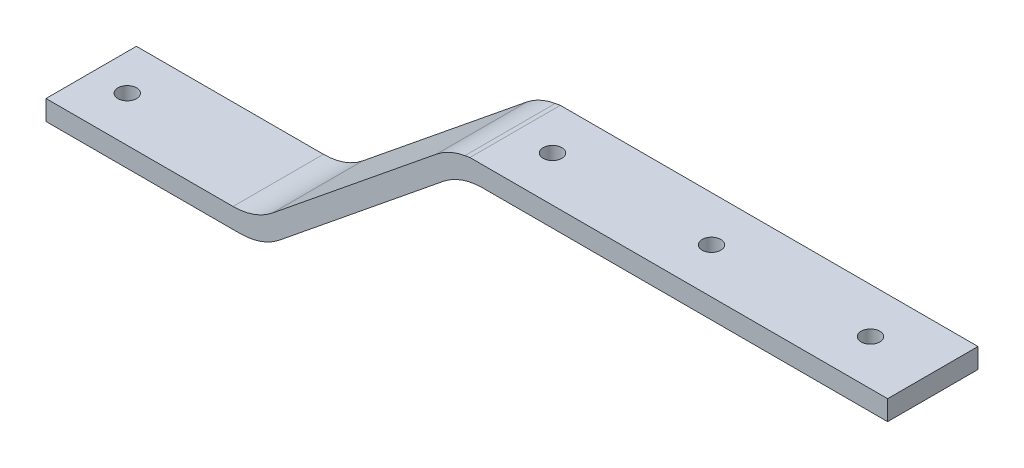
ISO-10303-21;
HEADER;
FILE_DESCRIPTION(('STEP AP214'),'2;1');
FILE_NAME('part.step','',(''),(''),'','','');
FILE_SCHEMA(('AUTOMOTIVE_DESIGN { 1 0 10303 214 1 1 1 1 }'));
ENDSEC;
DATA;
#1=APPLICATION_CONTEXT('core data for automotive mechanical design processes');
#2=APPLICATION_PROTOCOL_DEFINITION('international standard','automotive_design',2000,#1);
#3=PRODUCT_CONTEXT('',#1,'mechanical');
#4=PRODUCT('Part','Part','',(#3));
#5=PRODUCT_RELATED_PRODUCT_CATEGORY('part','',(#4));
#6=PRODUCT_DEFINITION_FORMATION('','',#4);
#7=PRODUCT_DEFINITION_CONTEXT('part definition',#1,'design');
#8=PRODUCT_DEFINITION('design','',#6,#7);
#9=PRODUCT_DEFINITION_SHAPE('','',#8);
#10=(LENGTH_UNIT() NAMED_UNIT(*) SI_UNIT(.MILLI.,.METRE.));
#11=(NAMED_UNIT(*) PLANE_ANGLE_UNIT() SI_UNIT($,.RADIAN.));
#12=(NAMED_UNIT(*) SI_UNIT($,.STERADIAN.) SOLID_ANGLE_UNIT());
#13=UNCERTAINTY_MEASURE_WITH_UNIT(LENGTH_MEASURE(1.E-05),#10,'distance_accuracy_value','');
#14=(GEOMETRIC_REPRESENTATION_CONTEXT(3) GLOBAL_UNCERTAINTY_ASSIGNED_CONTEXT((#13)) GLOBAL_UNIT_ASSIGNED_CONTEXT((#10,
#11,#12)) REPRESENTATION_CONTEXT('',''));
#15=CARTESIAN_POINT('',(0.,0.,0.));
#16=DIRECTION('',(0.,0.,1.));
#17=DIRECTION('',(1.,0.,0.));
#18=AXIS2_PLACEMENT_3D('',#15,#16,#17);
#19=CARTESIAN_POINT('',(-0.807686987093969,41.218627607551,14.5));
#20=DIRECTION('',(0.172838159716736,-0.984950237598698,0.));
#21=DIRECTION('',(0.984950237598698,0.172838159716736,0.));
#22=AXIS2_PLACEMENT_3D('',#19,#20,#21);
#23=PLANE('',#22);
#24=DIRECTION('',(-0.984950237598698,-0.172838159716736,0.));
#25=VECTOR('',#24,1.);
#26=CARTESIAN_POINT('',(-0.807686987093969,41.218627607551,0.));
#27=LINE('',#26,#25);
#28=CARTESIAN_POINT('',(0.,41.3603597754795,0.));
#29=VERTEX_POINT('',#28);
#30=CARTESIAN_POINT('',(-0.807686987093971,41.218627607551,0.));
#31=VERTEX_POINT('',#30);
#32=EDGE_CURVE('E165',#29,#31,#27,.T.);
#33=ORIENTED_EDGE('',*,*,#32,.T.);
#34=DIRECTION('',(0.,0.,-1.));
#35=VECTOR('',#34,1.);
#36=CARTESIAN_POINT('',(-0.807686987093971,41.218627607551,14.5));
#37=LINE('',#36,#35);
#38=CARTESIAN_POINT('',(-0.807686987093971,41.218627607551,14.5));
#39=VERTEX_POINT('',#38);
#40=EDGE_CURVE('E11',#39,#31,#37,.T.);
#41=ORIENTED_EDGE('',*,*,#40,.F.);
#42=DIRECTION('',(-0.984950237598698,-0.172838159716736,0.));
#43=VECTOR('',#42,1.);
#44=CARTESIAN_POINT('',(-0.807686987093969,41.218627607551,14.5));
#45=LINE('',#44,#43);
#46=CARTESIAN_POINT('',(0.,41.3603597754795,14.5));
#47=VERTEX_POINT('',#46);
#48=EDGE_CURVE('E190',#47,#39,#45,.T.);
#49=ORIENTED_EDGE('',*,*,#48,.F.);
#50=DIRECTION('',(0.,0.,-1.));
#51=VECTOR('',#50,1.);
#52=CARTESIAN_POINT('',(0.,41.3603597754795,14.5));
#53=LINE('',#52,#51);
#54=EDGE_CURVE('E161',#47,#29,#53,.T.);
#55=ORIENTED_EDGE('',*,*,#54,.T.);
#56=EDGE_LOOP('',(#33,#41,#49,#55));
#57=FACE_BOUND('',#56,.T.);
#58=ADVANCED_FACE('F39',(#57),#23,.F.);
#59=CARTESIAN_POINT('',(0.92069461007336,31.3691252315641,14.5));
#60=DIRECTION('',(0.,0.,-1.));
#61=DIRECTION('',(-1.,0.,0.));
#62=AXIS2_PLACEMENT_3D('',#59,#60,#61);
#63=CYLINDRICAL_SURFACE('',#62,10.);
#64=CARTESIAN_POINT('',(0.92069461007336,31.3691252315641,0.));
#65=DIRECTION('',(0.,0.,1.));
#66=DIRECTION('',(-1.,0.,0.));
#67=AXIS2_PLACEMENT_3D('',#64,#65,#66);
#68=CIRCLE('',#67,10.);
#69=CARTESIAN_POINT('',(-5.37724756776064,39.1367454800481,0.));
#70=VERTEX_POINT('',#69);
#71=EDGE_CURVE('E168',#31,#70,#68,.T.);
#72=ORIENTED_EDGE('',*,*,#71,.T.);
#73=DIRECTION('',(0.,0.,-1.));
#74=VECTOR('',#73,1.);
#75=CARTESIAN_POINT('',(-5.37724756776064,39.1367454800481,14.5));
#76=LINE('',#75,#74);
#77=CARTESIAN_POINT('',(-5.37724756776064,39.1367454800481,14.5));
#78=VERTEX_POINT('',#77);
#79=EDGE_CURVE('E47',#78,#70,#76,.T.);
#80=ORIENTED_EDGE('',*,*,#79,.F.);
#81=CARTESIAN_POINT('',(0.92069461007336,31.3691252315641,14.5));
#82=DIRECTION('',(0.,0.,1.));
#83=DIRECTION('',(-1.,0.,0.));
#84=AXIS2_PLACEMENT_3D('',#81,#82,#83);
#85=CIRCLE('',#84,10.);
#86=EDGE_CURVE('E113',#39,#78,#85,.T.);
#87=ORIENTED_EDGE('',*,*,#86,.F.);
#88=ORIENTED_EDGE('',*,*,#40,.T.);
#89=EDGE_LOOP('',(#72,#80,#87,#88));
#90=FACE_BOUND('',#89,.T.);
#91=ADVANCED_FACE('F278',(#90),#63,.T.);
#92=CARTESIAN_POINT('',(-31.702057822166,17.7927395269954,14.5));
#93=DIRECTION('',(0.6297942177834,-0.776762024848406,0.));
#94=DIRECTION('',(0.776762024848406,0.6297942177834,0.));
#95=AXIS2_PLACEMENT_3D('',#92,#93,#94);
#96=PLANE('',#95);
#97=DIRECTION('',(-0.776762024848406,-0.6297942177834,0.));
#98=VECTOR('',#97,1.);
#99=CARTESIAN_POINT('',(-31.702057822166,17.7927395269954,0.));
#100=LINE('',#99,#98);
#101=CARTESIAN_POINT('',(-31.702057822166,17.7927395269954,0.));
#102=VERTEX_POINT('',#101);
#103=EDGE_CURVE('E171',#70,#102,#100,.T.);
#104=ORIENTED_EDGE('',*,*,#103,.T.);
#105=DIRECTION('',(0.,0.,-1.));
#106=VECTOR('',#105,1.);
#107=CARTESIAN_POINT('',(-31.702057822166,17.7927395269954,14.5));
#108=LINE('',#107,#106);
#109=CARTESIAN_POINT('',(-31.702057822166,17.7927395269954,14.5));
#110=VERTEX_POINT('',#109);
#111=EDGE_CURVE('E212',#110,#102,#108,.T.);
#112=ORIENTED_EDGE('',*,*,#111,.F.);
#113=DIRECTION('',(-0.776762024848406,-0.6297942177834,0.));
#114=VECTOR('',#113,1.);
#115=CARTESIAN_POINT('',(-31.702057822166,17.7927395269954,14.5));
#116=LINE('',#115,#114);
#117=EDGE_CURVE('E220',#78,#110,#116,.T.);
#118=ORIENTED_EDGE('',*,*,#117,.F.);
#119=ORIENTED_EDGE('',*,*,#79,.T.);
#120=EDGE_LOOP('',(#104,#112,#118,#119));
#121=FACE_BOUND('',#120,.T.);
#122=ADVANCED_FACE('F218',(#121),#96,.F.);
#123=CARTESIAN_POINT('',(-38.,25.5603597754795,14.5));
#124=DIRECTION('',(0.,0.,-1.));
#125=DIRECTION('',(-1.,0.,0.));
#126=AXIS2_PLACEMENT_3D('',#123,#124,#125);
#127=CYLINDRICAL_SURFACE('',#126,10.);
#128=CARTESIAN_POINT('',(-38.,25.5603597754795,0.));
#129=DIRECTION('',(0.,0.,-1.));
#130=DIRECTION('',(1.,0.,0.));
#131=AXIS2_PLACEMENT_3D('',#128,#129,#130);
#132=CIRCLE('',#131,10.);
#133=CARTESIAN_POINT('',(-38.,15.5603597754795,0.));
#134=VERTEX_POINT('',#133);
#135=EDGE_CURVE('E173',#102,#134,#132,.T.);
#136=ORIENTED_EDGE('',*,*,#135,.T.);
#137=DIRECTION('',(0.,0.,-1.));
#138=VECTOR('',#137,1.);
#139=CARTESIAN_POINT('',(-38.,15.5603597754795,14.5));
#140=LINE('',#139,#138);
#141=CARTESIAN_POINT('',(-38.,15.5603597754795,14.5));
#142=VERTEX_POINT('',#141);
#143=EDGE_CURVE('E209',#142,#134,#140,.T.);
#144=ORIENTED_EDGE('',*,*,#143,.F.);
#145=CARTESIAN_POINT('',(-38.,25.5603597754795,14.5));
#146=DIRECTION('',(0.,0.,-1.));
#147=DIRECTION('',(1.,0.,0.));
#148=AXIS2_PLACEMENT_3D('',#145,#146,#147);
#149=CIRCLE('',#148,10.);
#150=EDGE_CURVE('E238',#110,#142,#149,.T.);
#151=ORIENTED_EDGE('',*,*,#150,.F.);
#152=ORIENTED_EDGE('',*,*,#111,.T.);
#153=EDGE_LOOP('',(#136,#144,#151,#152));
#154=FACE_BOUND('',#153,.T.);
#155=ADVANCED_FACE('F229',(#154),#127,.F.);
#156=CARTESIAN_POINT('',(-68.,15.5603597754795,14.5));
#157=DIRECTION('',(0.,-1.,0.));
#158=DIRECTION('',(0.,0.,-1.));
#159=AXIS2_PLACEMENT_3D('',#156,#157,#158);
#160=PLANE('',#159);
#161=CARTESIAN_POINT('',(-62.2149157586052,15.5603597754795,7.25));
#162=DIRECTION('',(0.,-1.,0.));
#163=DIRECTION('',(0.,0.,-1.));
#164=AXIS2_PLACEMENT_3D('',#161,#162,#163);
#165=CIRCLE('',#164,1.5);
#166=CARTESIAN_POINT('',(-62.2149157586052,15.5603597754795,5.74999999999999));
#167=VERTEX_POINT('',#166);
#168=EDGE_CURVE('E169',#167,#167,#165,.T.);
#169=ORIENTED_EDGE('',*,*,#168,.T.);
#170=EDGE_LOOP('',(#169));
#171=FACE_BOUND('',#170,.T.);
#172=DIRECTION('',(-1.,0.,0.));
#173=VECTOR('',#172,1.);
#174=CARTESIAN_POINT('',(-68.,15.5603597754795,0.));
#175=LINE('',#174,#173);
#176=CARTESIAN_POINT('',(-68.,15.5603597754795,0.));
#177=VERTEX_POINT('',#176);
#178=EDGE_CURVE('E175',#134,#177,#175,.T.);
#179=ORIENTED_EDGE('',*,*,#178,.T.);
#180=DIRECTION('',(0.,0.,-1.));
#181=VECTOR('',#180,1.);
#182=CARTESIAN_POINT('',(-68.,15.5603597754795,14.5));
#183=LINE('',#182,#181);
#184=CARTESIAN_POINT('',(-68.,15.5603597754795,14.5));
#185=VERTEX_POINT('',#184);
#186=EDGE_CURVE('E206',#185,#177,#183,.T.);
#187=ORIENTED_EDGE('',*,*,#186,.F.);
#188=DIRECTION('',(-1.,0.,0.));
#189=VECTOR('',#188,1.);
#190=CARTESIAN_POINT('',(-68.,15.5603597754795,14.5));
#191=LINE('',#190,#189);
#192=EDGE_CURVE('E235',#142,#185,#191,.T.);
#193=ORIENTED_EDGE('',*,*,#192,.F.);
#194=ORIENTED_EDGE('',*,*,#143,.T.);
#195=EDGE_LOOP('',(#179,#187,#193,#194));
#196=FACE_BOUND('',#195,.T.);
#197=ADVANCED_FACE('F233',(#171,#196),#160,.F.);
#198=CARTESIAN_POINT('',(-68.,12.3603597754795,14.5));
#199=DIRECTION('',(1.,0.,0.));
#200=DIRECTION('',(0.,1.,0.));
#201=AXIS2_PLACEMENT_3D('',#198,#199,#200);
#202=PLANE('',#201);
#203=DIRECTION('',(0.,-1.,0.));
#204=VECTOR('',#203,1.);
#205=CARTESIAN_POINT('',(-68.,12.3603597754795,0.));
#206=LINE('',#205,#204);
#207=CARTESIAN_POINT('',(-68.,12.3603597754795,0.));
#208=VERTEX_POINT('',#207);
#209=EDGE_CURVE('E177',#177,#208,#206,.T.);
#210=ORIENTED_EDGE('',*,*,#209,.T.);
#211=DIRECTION('',(0.,0.,-1.));
#212=VECTOR('',#211,1.);
#213=CARTESIAN_POINT('',(-68.,12.3603597754795,14.5));
#214=LINE('',#213,#212);
#215=CARTESIAN_POINT('',(-68.,12.3603597754795,14.5));
#216=VERTEX_POINT('',#215);
#217=EDGE_CURVE('E203',#216,#208,#214,.T.);
#218=ORIENTED_EDGE('',*,*,#217,.F.);
#219=DIRECTION('',(0.,-1.,0.));
#220=VECTOR('',#219,1.);
#221=CARTESIAN_POINT('',(-68.,12.3603597754795,14.5));
#222=LINE('',#221,#220);
#223=EDGE_CURVE('E237',#185,#216,#222,.T.);
#224=ORIENTED_EDGE('',*,*,#223,.F.);
#225=ORIENTED_EDGE('',*,*,#186,.T.);
#226=EDGE_LOOP('',(#210,#218,#224,#225));
#227=FACE_BOUND('',#226,.T.);
#228=ADVANCED_FACE('F291',(#227),#202,.F.);
#229=CARTESIAN_POINT('',(-36.8657223259379,12.3603597754795,14.5));
#230=DIRECTION('',(0.,1.,0.));
#231=DIRECTION('',(-1.,0.,0.));
#232=AXIS2_PLACEMENT_3D('',#229,#230,#231);
#233=PLANE('',#232);
#234=CARTESIAN_POINT('',(-62.2149157586052,12.3603597754795,7.25));
#235=DIRECTION('',(0.,1.,0.));
#236=DIRECTION('',(0.,0.,1.));
#237=AXIS2_PLACEMENT_3D('',#234,#235,#236);
#238=CIRCLE('',#237,1.5);
#239=CARTESIAN_POINT('',(-62.2149157586052,12.3603597754795,8.75));
#240=VERTEX_POINT('',#239);
#241=EDGE_CURVE('E444',#240,#240,#238,.T.);
#242=ORIENTED_EDGE('',*,*,#241,.T.);
#243=EDGE_LOOP('',(#242));
#244=FACE_BOUND('',#243,.T.);
#245=DIRECTION('',(1.,0.,0.));
#246=VECTOR('',#245,1.);
#247=CARTESIAN_POINT('',(-36.8657223259379,12.3603597754795,0.));
#248=LINE('',#247,#246);
#249=CARTESIAN_POINT('',(-36.8657223259379,12.3603597754795,0.));
#250=VERTEX_POINT('',#249);
#251=EDGE_CURVE('E179',#208,#250,#248,.T.);
#252=ORIENTED_EDGE('',*,*,#251,.T.);
#253=DIRECTION('',(0.,0.,-1.));
#254=VECTOR('',#253,1.);
#255=CARTESIAN_POINT('',(-36.8657223259379,12.3603597754795,14.5));
#256=LINE('',#255,#254);
#257=CARTESIAN_POINT('',(-36.8657223259379,12.3603597754795,14.5));
#258=VERTEX_POINT('',#257);
#259=EDGE_CURVE('E200',#258,#250,#256,.T.);
#260=ORIENTED_EDGE('',*,*,#259,.F.);
#261=DIRECTION('',(1.,0.,0.));
#262=VECTOR('',#261,1.);
#263=CARTESIAN_POINT('',(-36.8657223259379,12.3603597754795,14.5));
#264=LINE('',#263,#262);
#265=EDGE_CURVE('E240',#216,#258,#264,.T.);
#266=ORIENTED_EDGE('',*,*,#265,.F.);
#267=ORIENTED_EDGE('',*,*,#217,.T.);
#268=EDGE_LOOP('',(#252,#260,#266,#267));
#269=FACE_BOUND('',#268,.T.);
#270=ADVANCED_FACE('F295',(#244,#269),#233,.F.);
#271=CARTESIAN_POINT('',(-36.8657223259379,22.3603597754795,14.5));
#272=DIRECTION('',(0.,0.,-1.));
#273=DIRECTION('',(-1.,0.,0.));
#274=AXIS2_PLACEMENT_3D('',#271,#272,#273);
#275=CYLINDRICAL_SURFACE('',#274,10.);
#276=CARTESIAN_POINT('',(-36.8657223259379,22.3603597754795,0.));
#277=DIRECTION('',(0.,0.,1.));
#278=DIRECTION('',(-1.,0.,0.));
#279=AXIS2_PLACEMENT_3D('',#276,#277,#278);
#280=CIRCLE('',#279,10.);
#281=CARTESIAN_POINT('',(-30.5677801481039,14.5927395269954,0.));
#282=VERTEX_POINT('',#281);
#283=EDGE_CURVE('E181',#250,#282,#280,.T.);
#284=ORIENTED_EDGE('',*,*,#283,.T.);
#285=DIRECTION('',(0.,0.,-1.));
#286=VECTOR('',#285,1.);
#287=CARTESIAN_POINT('',(-30.5677801481039,14.5927395269954,14.5));
#288=LINE('',#287,#286);
#289=CARTESIAN_POINT('',(-30.5677801481039,14.5927395269954,14.5));
#290=VERTEX_POINT('',#289);
#291=EDGE_CURVE('E197',#290,#282,#288,.T.);
#292=ORIENTED_EDGE('',*,*,#291,.F.);
#293=CARTESIAN_POINT('',(-36.8657223259379,22.3603597754795,14.5));
#294=DIRECTION('',(0.,0.,1.));
#295=DIRECTION('',(-1.,0.,0.));
#296=AXIS2_PLACEMENT_3D('',#293,#294,#295);
#297=CIRCLE('',#296,10.);
#298=EDGE_CURVE('E246',#258,#290,#297,.T.);
#299=ORIENTED_EDGE('',*,*,#298,.F.);
#300=ORIENTED_EDGE('',*,*,#259,.T.);
#301=EDGE_LOOP('',(#284,#292,#299,#300));
#302=FACE_BOUND('',#301,.T.);
#303=ADVANCED_FACE('F299',(#302),#275,.T.);
#304=CARTESIAN_POINT('',(-4.25378084309242,35.9279800239635,14.5));
#305=DIRECTION('',(-0.6297942177834,0.776762024848406,0.));
#306=DIRECTION('',(-0.776762024848406,-0.6297942177834,0.));
#307=AXIS2_PLACEMENT_3D('',#304,#305,#306);
#308=PLANE('',#307);
#309=DIRECTION('',(0.776762024848406,0.6297942177834,0.));
#310=VECTOR('',#309,1.);
#311=CARTESIAN_POINT('',(-4.25378084309242,35.9279800239635,0.));
#312=LINE('',#311,#310);
#313=CARTESIAN_POINT('',(-4.25378084309241,35.9279800239635,0.));
#314=VERTEX_POINT('',#313);
#315=EDGE_CURVE('E183',#282,#314,#312,.T.);
#316=ORIENTED_EDGE('',*,*,#315,.T.);
#317=DIRECTION('',(0.,0.,-1.));
#318=VECTOR('',#317,1.);
#319=CARTESIAN_POINT('',(-4.25378084309241,35.9279800239635,14.5));
#320=LINE('',#319,#318);
#321=CARTESIAN_POINT('',(-4.25378084309241,35.9279800239635,14.5));
#322=VERTEX_POINT('',#321);
#323=EDGE_CURVE('E194',#322,#314,#320,.T.);
#324=ORIENTED_EDGE('',*,*,#323,.F.);
#325=DIRECTION('',(0.776762024848406,0.6297942177834,0.));
#326=VECTOR('',#325,1.);
#327=CARTESIAN_POINT('',(-4.25378084309242,35.9279800239635,14.5));
#328=LINE('',#327,#326);
#329=EDGE_CURVE('E248',#290,#322,#328,.T.);
#330=ORIENTED_EDGE('',*,*,#329,.F.);
#331=ORIENTED_EDGE('',*,*,#291,.T.);
#332=EDGE_LOOP('',(#316,#324,#330,#331));
#333=FACE_BOUND('',#332,.T.);
#334=ADVANCED_FACE('F254',(#333),#308,.F.);
#335=CARTESIAN_POINT('',(2.04416133474158,28.1603597754795,14.5));
#336=DIRECTION('',(0.,0.,-1.));
#337=DIRECTION('',(-1.,0.,0.));
#338=AXIS2_PLACEMENT_3D('',#335,#336,#337);
#339=CYLINDRICAL_SURFACE('',#338,10.);
#340=CARTESIAN_POINT('',(2.04416133474158,28.1603597754795,0.));
#341=DIRECTION('',(0.,0.,-1.));
#342=DIRECTION('',(1.,0.,0.));
#343=AXIS2_PLACEMENT_3D('',#340,#341,#342);
#344=CIRCLE('',#343,10.);
#345=CARTESIAN_POINT('',(2.04416133474158,38.1603597754795,0.));
#346=VERTEX_POINT('',#345);
#347=EDGE_CURVE('E185',#314,#346,#344,.T.);
#348=ORIENTED_EDGE('',*,*,#347,.T.);
#349=DIRECTION('',(0.,0.,-1.));
#350=VECTOR('',#349,1.);
#351=CARTESIAN_POINT('',(2.04416133474158,38.1603597754795,14.5));
#352=LINE('',#351,#350);
#353=CARTESIAN_POINT('',(2.04416133474158,38.1603597754795,14.5));
#354=VERTEX_POINT('',#353);
#355=EDGE_CURVE('E156',#354,#346,#352,.T.);
#356=ORIENTED_EDGE('',*,*,#355,.F.);
#357=CARTESIAN_POINT('',(2.04416133474158,28.1603597754795,14.5));
#358=DIRECTION('',(0.,0.,-1.));
#359=DIRECTION('',(1.,0.,0.));
#360=AXIS2_PLACEMENT_3D('',#357,#358,#359);
#361=CIRCLE('',#360,10.);
#362=EDGE_CURVE('E147',#322,#354,#361,.T.);
#363=ORIENTED_EDGE('',*,*,#362,.F.);
#364=ORIENTED_EDGE('',*,*,#323,.T.);
#365=EDGE_LOOP('',(#348,#356,#363,#364));
#366=FACE_BOUND('',#365,.T.);
#367=ADVANCED_FACE('F258',(#366),#339,.F.);
#368=CARTESIAN_POINT('',(67.,38.1603597754795,14.5));
#369=DIRECTION('',(0.,1.,0.));
#370=DIRECTION('',(-1.,0.,0.));
#371=AXIS2_PLACEMENT_3D('',#368,#369,#370);
#372=PLANE('',#371);
#373=CARTESIAN_POINT('',(57.,38.1603597754795,7.25));
#374=DIRECTION('',(0.,1.,0.));
#375=DIRECTION('',(-1.,0.,0.));
#376=AXIS2_PLACEMENT_3D('',#373,#374,#375);
#377=CIRCLE('',#376,1.5);
#378=CARTESIAN_POINT('',(55.5,38.1603597754795,7.25));
#379=VERTEX_POINT('',#378);
#380=EDGE_CURVE('E314',#379,#379,#377,.T.);
#381=ORIENTED_EDGE('',*,*,#380,.T.);
#382=EDGE_LOOP('',(#381));
#383=FACE_BOUND('',#382,.T.);
#384=CARTESIAN_POINT('',(31.5,38.1603597754795,7.25));
#385=DIRECTION('',(0.,1.,0.));
#386=DIRECTION('',(-1.,0.,0.));
#387=AXIS2_PLACEMENT_3D('',#384,#385,#386);
#388=CIRCLE('',#387,1.5);
#389=CARTESIAN_POINT('',(30.,38.1603597754795,7.25));
#390=VERTEX_POINT('',#389);
#391=EDGE_CURVE('E318',#390,#390,#388,.T.);
#392=ORIENTED_EDGE('',*,*,#391,.T.);
#393=EDGE_LOOP('',(#392));
#394=FACE_BOUND('',#393,.T.);
#395=CARTESIAN_POINT('',(5.99999999999999,38.1603597754795,7.25));
#396=DIRECTION('',(0.,1.,0.));
#397=DIRECTION('',(-1.,0.,0.));
#398=AXIS2_PLACEMENT_3D('',#395,#396,#397);
#399=CIRCLE('',#398,1.5);
#400=CARTESIAN_POINT('',(4.49999999999999,38.1603597754795,7.25));
#401=VERTEX_POINT('',#400);
#402=EDGE_CURVE('E321',#401,#401,#399,.T.);
#403=ORIENTED_EDGE('',*,*,#402,.T.);
#404=EDGE_LOOP('',(#403));
#405=FACE_BOUND('',#404,.T.);
#406=DIRECTION('',(1.,0.,0.));
#407=VECTOR('',#406,1.);
#408=CARTESIAN_POINT('',(67.,38.1603597754795,0.));
#409=LINE('',#408,#407);
#410=CARTESIAN_POINT('',(67.,38.1603597754795,0.));
#411=VERTEX_POINT('',#410);
#412=EDGE_CURVE('E155',#346,#411,#409,.T.);
#413=ORIENTED_EDGE('',*,*,#412,.T.);
#414=DIRECTION('',(0.,0.,-1.));
#415=VECTOR('',#414,1.);
#416=CARTESIAN_POINT('',(67.,38.1603597754795,14.5));
#417=LINE('',#416,#415);
#418=CARTESIAN_POINT('',(67.,38.1603597754795,14.5));
#419=VERTEX_POINT('',#418);
#420=EDGE_CURVE('E152',#419,#411,#417,.T.);
#421=ORIENTED_EDGE('',*,*,#420,.F.);
#422=DIRECTION('',(1.,0.,0.));
#423=VECTOR('',#422,1.);
#424=CARTESIAN_POINT('',(67.,38.1603597754795,14.5));
#425=LINE('',#424,#423);
#426=EDGE_CURVE('E141',#354,#419,#425,.T.);
#427=ORIENTED_EDGE('',*,*,#426,.F.);
#428=ORIENTED_EDGE('',*,*,#355,.T.);
#429=EDGE_LOOP('',(#413,#421,#427,#428));
#430=FACE_BOUND('',#429,.T.);
#431=ADVANCED_FACE('F153',(#383,#394,#405,#430),#372,.F.);
#432=CARTESIAN_POINT('',(67.,41.3603597754795,14.5));
#433=DIRECTION('',(-1.,0.,0.));
#434=DIRECTION('',(0.,0.,1.));
#435=AXIS2_PLACEMENT_3D('',#432,#433,#434);
#436=PLANE('',#435);
#437=DIRECTION('',(0.,1.,0.));
#438=VECTOR('',#437,1.);
#439=CARTESIAN_POINT('',(67.,41.3603597754795,0.));
#440=LINE('',#439,#438);
#441=CARTESIAN_POINT('',(67.,41.3603597754795,0.));
#442=VERTEX_POINT('',#441);
#443=EDGE_CURVE('E99',#411,#442,#440,.T.);
#444=ORIENTED_EDGE('',*,*,#443,.T.);
#445=DIRECTION('',(0.,0.,-1.));
#446=VECTOR('',#445,1.);
#447=CARTESIAN_POINT('',(67.,41.3603597754795,14.5));
#448=LINE('',#447,#446);
#449=CARTESIAN_POINT('',(67.,41.3603597754795,14.5));
#450=VERTEX_POINT('',#449);
#451=EDGE_CURVE('E157',#450,#442,#448,.T.);
#452=ORIENTED_EDGE('',*,*,#451,.F.);
#453=DIRECTION('',(0.,1.,0.));
#454=VECTOR('',#453,1.);
#455=CARTESIAN_POINT('',(67.,41.3603597754795,14.5));
#456=LINE('',#455,#454);
#457=EDGE_CURVE('E145',#419,#450,#456,.T.);
#458=ORIENTED_EDGE('',*,*,#457,.F.);
#459=ORIENTED_EDGE('',*,*,#420,.T.);
#460=EDGE_LOOP('',(#444,#452,#458,#459));
#461=FACE_BOUND('',#460,.T.);
#462=ADVANCED_FACE('F159',(#461),#436,.F.);
#463=CARTESIAN_POINT('',(0.,41.3603597754795,14.5));
#464=DIRECTION('',(0.,-1.,0.));
#465=DIRECTION('',(0.,0.,-1.));
#466=AXIS2_PLACEMENT_3D('',#463,#464,#465);
#467=PLANE('',#466);
#468=CARTESIAN_POINT('',(57.,41.3603597754795,7.25));
#469=DIRECTION('',(0.,1.,0.));
#470=DIRECTION('',(0.,0.,1.));
#471=AXIS2_PLACEMENT_3D('',#468,#469,#470);
#472=CIRCLE('',#471,1.5);
#473=CARTESIAN_POINT('',(57.,41.3603597754795,8.75));
#474=VERTEX_POINT('',#473);
#475=EDGE_CURVE('E441',#474,#474,#472,.T.);
#476=ORIENTED_EDGE('',*,*,#475,.F.);
#477=EDGE_LOOP('',(#476));
#478=FACE_BOUND('',#477,.T.);
#479=CARTESIAN_POINT('',(31.5,41.3603597754795,7.25));
#480=DIRECTION('',(0.,1.,0.));
#481=DIRECTION('',(0.,0.,1.));
#482=AXIS2_PLACEMENT_3D('',#479,#480,#481);
#483=CIRCLE('',#482,1.5);
#484=CARTESIAN_POINT('',(31.5,41.3603597754795,8.75));
#485=VERTEX_POINT('',#484);
#486=EDGE_CURVE('E327',#485,#485,#483,.T.);
#487=ORIENTED_EDGE('',*,*,#486,.F.);
#488=EDGE_LOOP('',(#487));
#489=FACE_BOUND('',#488,.T.);
#490=CARTESIAN_POINT('',(5.99999999999999,41.3603597754795,7.25));
#491=DIRECTION('',(0.,1.,0.));
#492=DIRECTION('',(0.,0.,1.));
#493=AXIS2_PLACEMENT_3D('',#490,#491,#492);
#494=CIRCLE('',#493,1.5);
#495=CARTESIAN_POINT('',(5.99999999999999,41.3603597754795,8.75));
#496=VERTEX_POINT('',#495);
#497=EDGE_CURVE('E323',#496,#496,#494,.T.);
#498=ORIENTED_EDGE('',*,*,#497,.F.);
#499=EDGE_LOOP('',(#498));
#500=FACE_BOUND('',#499,.T.);
#501=DIRECTION('',(-1.,0.,0.));
#502=VECTOR('',#501,1.);
#503=CARTESIAN_POINT('',(0.,41.3603597754795,0.));
#504=LINE('',#503,#502);
#505=EDGE_CURVE('E105',#442,#29,#504,.T.);
#506=ORIENTED_EDGE('',*,*,#505,.T.);
#507=ORIENTED_EDGE('',*,*,#54,.F.);
#508=DIRECTION('',(-1.,0.,0.));
#509=VECTOR('',#508,1.);
#510=CARTESIAN_POINT('',(0.,41.3603597754795,14.5));
#511=LINE('',#510,#509);
#512=EDGE_CURVE('E55',#450,#47,#511,.T.);
#513=ORIENTED_EDGE('',*,*,#512,.F.);
#514=ORIENTED_EDGE('',*,*,#451,.T.);
#515=EDGE_LOOP('',(#506,#507,#513,#514));
#516=FACE_BOUND('',#515,.T.);
#517=ADVANCED_FACE('F262',(#478,#489,#500,#516),#467,.F.);
#518=CARTESIAN_POINT('',(2.04416133474158,28.1603597754795,14.5));
#519=DIRECTION('',(0.,0.,1.));
#520=DIRECTION('',(1.,0.,0.));
#521=AXIS2_PLACEMENT_3D('',#518,#519,#520);
#522=PLANE('',#521);
#523=ORIENTED_EDGE('',*,*,#48,.T.);
#524=ORIENTED_EDGE('',*,*,#86,.T.);
#525=ORIENTED_EDGE('',*,*,#117,.T.);
#526=ORIENTED_EDGE('',*,*,#150,.T.);
#527=ORIENTED_EDGE('',*,*,#192,.T.);
#528=ORIENTED_EDGE('',*,*,#223,.T.);
#529=ORIENTED_EDGE('',*,*,#265,.T.);
#530=ORIENTED_EDGE('',*,*,#298,.T.);
#531=ORIENTED_EDGE('',*,*,#329,.T.);
#532=ORIENTED_EDGE('',*,*,#362,.T.);
#533=ORIENTED_EDGE('',*,*,#426,.T.);
#534=ORIENTED_EDGE('',*,*,#457,.T.);
#535=ORIENTED_EDGE('',*,*,#512,.T.);
#536=EDGE_LOOP('',(#523,#524,#525,#526,#527,#528,#529,#530,#531,#532,#533,#534,#535));
#537=FACE_BOUND('',#536,.T.);
#538=ADVANCED_FACE('F143',(#537),#522,.T.);
#539=CARTESIAN_POINT('',(2.04416133474158,28.1603597754795,0.));
#540=DIRECTION('',(0.,0.,1.));
#541=DIRECTION('',(1.,0.,0.));
#542=AXIS2_PLACEMENT_3D('',#539,#540,#541);
#543=PLANE('',#542);
#544=ORIENTED_EDGE('',*,*,#32,.F.);
#545=ORIENTED_EDGE('',*,*,#505,.F.);
#546=ORIENTED_EDGE('',*,*,#443,.F.);
#547=ORIENTED_EDGE('',*,*,#412,.F.);
#548=ORIENTED_EDGE('',*,*,#347,.F.);
#549=ORIENTED_EDGE('',*,*,#315,.F.);
#550=ORIENTED_EDGE('',*,*,#283,.F.);
#551=ORIENTED_EDGE('',*,*,#251,.F.);
#552=ORIENTED_EDGE('',*,*,#209,.F.);
#553=ORIENTED_EDGE('',*,*,#178,.F.);
#554=ORIENTED_EDGE('',*,*,#135,.F.);
#555=ORIENTED_EDGE('',*,*,#103,.F.);
#556=ORIENTED_EDGE('',*,*,#71,.F.);
#557=EDGE_LOOP('',(#544,#545,#546,#547,#548,#549,#550,#551,#552,#553,#554,#555,#556));
#558=FACE_BOUND('',#557,.T.);
#559=ADVANCED_FACE('F224',(#558),#543,.F.);
#560=CARTESIAN_POINT('',(5.99999999999999,12.3603597754795,7.25));
#561=DIRECTION('',(0.,1.,0.));
#562=DIRECTION('',(0.,0.,1.));
#563=AXIS2_PLACEMENT_3D('',#560,#561,#562);
#564=CYLINDRICAL_SURFACE('',#563,1.5);
#565=ORIENTED_EDGE('',*,*,#497,.T.);
#566=EDGE_LOOP('',(#565));
#567=FACE_BOUND('',#566,.T.);
#568=ORIENTED_EDGE('',*,*,#402,.F.);
#569=EDGE_LOOP('',(#568));
#570=FACE_BOUND('',#569,.T.);
#571=ADVANCED_FACE('F351',(#567,#570),#564,.F.);
#572=CARTESIAN_POINT('',(31.5,12.3603597754795,7.25));
#573=DIRECTION('',(0.,1.,0.));
#574=DIRECTION('',(0.,0.,1.));
#575=AXIS2_PLACEMENT_3D('',#572,#573,#574);
#576=CYLINDRICAL_SURFACE('',#575,1.5);
#577=ORIENTED_EDGE('',*,*,#486,.T.);
#578=EDGE_LOOP('',(#577));
#579=FACE_BOUND('',#578,.T.);
#580=ORIENTED_EDGE('',*,*,#391,.F.);
#581=EDGE_LOOP('',(#580));
#582=FACE_BOUND('',#581,.T.);
#583=ADVANCED_FACE('F345',(#579,#582),#576,.F.);
#584=CARTESIAN_POINT('',(57.,12.3603597754795,7.25));
#585=DIRECTION('',(0.,1.,0.));
#586=DIRECTION('',(0.,0.,1.));
#587=AXIS2_PLACEMENT_3D('',#584,#585,#586);
#588=CYLINDRICAL_SURFACE('',#587,1.5);
#589=ORIENTED_EDGE('',*,*,#475,.T.);
#590=EDGE_LOOP('',(#589));
#591=FACE_BOUND('',#590,.T.);
#592=ORIENTED_EDGE('',*,*,#380,.F.);
#593=EDGE_LOOP('',(#592));
#594=FACE_BOUND('',#593,.T.);
#595=ADVANCED_FACE('F339',(#591,#594),#588,.F.);
#596=CARTESIAN_POINT('',(-62.2149157586052,12.3603597754795,7.25));
#597=DIRECTION('',(0.,1.,0.));
#598=DIRECTION('',(0.,0.,1.));
#599=AXIS2_PLACEMENT_3D('',#596,#597,#598);
#600=CYLINDRICAL_SURFACE('',#599,1.5);
#601=ORIENTED_EDGE('',*,*,#241,.F.);
#602=EDGE_LOOP('',(#601));
#603=FACE_BOUND('',#602,.T.);
#604=ORIENTED_EDGE('',*,*,#168,.F.);
#605=EDGE_LOOP('',(#604));
#606=FACE_BOUND('',#605,.T.);
#607=ADVANCED_FACE('F337',(#603,#606),#600,.F.);
#608=CLOSED_SHELL('',(#58,#91,#122,#155,#197,#228,#270,#303,#334,#367,#431,#462,#517,#538,#559,
#571,#583,#595,#607));
#609=MANIFOLD_SOLID_BREP('B2',#608);
#610=ADVANCED_BREP_SHAPE_REPRESENTATION('',(#18,#609),#14);
#611=SHAPE_DEFINITION_REPRESENTATION(#9,#610);
ENDSEC;
END-ISO-10303-21;
